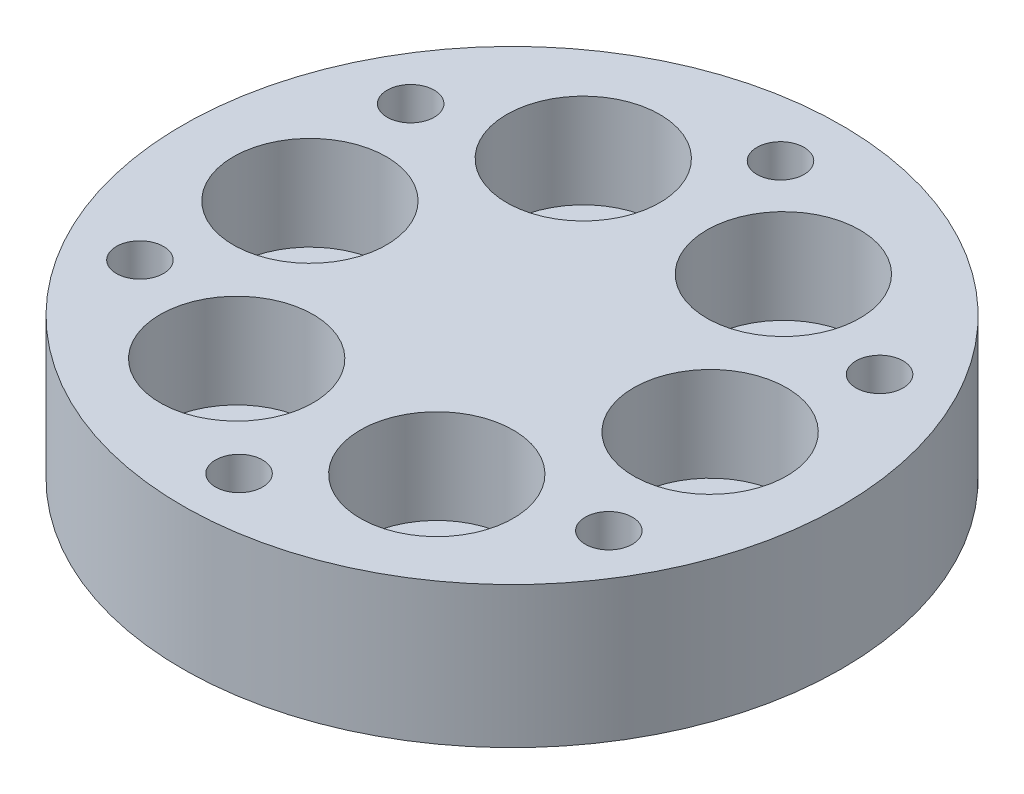
ISO-10303-21;
HEADER;
FILE_DESCRIPTION(('STEP AP214'),'2;1');
FILE_NAME('part.step','',(''),(''),'','','');
FILE_SCHEMA(('AUTOMOTIVE_DESIGN { 1 0 10303 214 1 1 1 1 }'));
ENDSEC;
DATA;
#1=APPLICATION_CONTEXT('core data for automotive mechanical design processes');
#2=APPLICATION_PROTOCOL_DEFINITION('international standard','automotive_design',2000,#1);
#3=PRODUCT_CONTEXT('',#1,'mechanical');
#4=PRODUCT('Part','Part','',(#3));
#5=PRODUCT_RELATED_PRODUCT_CATEGORY('part','',(#4));
#6=PRODUCT_DEFINITION_FORMATION('','',#4);
#7=PRODUCT_DEFINITION_CONTEXT('part definition',#1,'design');
#8=PRODUCT_DEFINITION('design','',#6,#7);
#9=PRODUCT_DEFINITION_SHAPE('','',#8);
#10=(LENGTH_UNIT() NAMED_UNIT(*) SI_UNIT(.MILLI.,.METRE.));
#11=(NAMED_UNIT(*) PLANE_ANGLE_UNIT() SI_UNIT($,.RADIAN.));
#12=(NAMED_UNIT(*) SI_UNIT($,.STERADIAN.) SOLID_ANGLE_UNIT());
#13=UNCERTAINTY_MEASURE_WITH_UNIT(LENGTH_MEASURE(1.E-05),#10,'distance_accuracy_value','');
#14=(GEOMETRIC_REPRESENTATION_CONTEXT(3) GLOBAL_UNCERTAINTY_ASSIGNED_CONTEXT((#13)) GLOBAL_UNIT_ASSIGNED_CONTEXT((#10,
#11,#12)) REPRESENTATION_CONTEXT('',''));
#15=CARTESIAN_POINT('',(0.,0.,0.));
#16=DIRECTION('',(0.,0.,1.));
#17=DIRECTION('',(1.,0.,0.));
#18=AXIS2_PLACEMENT_3D('',#15,#16,#17);
#19=CARTESIAN_POINT('',(0.0216779736944117,0.,-0.151745803292673));
#20=DIRECTION('',(0.,1.,0.));
#21=DIRECTION('',(1.,0.,0.));
#22=AXIS2_PLACEMENT_3D('',#19,#20,#21);
#23=PLANE('',#22);
#24=CARTESIAN_POINT('',(0.0493775983705208,0.,23.0711107078364));
#25=DIRECTION('',(0.,-1.,0.));
#26=DIRECTION('',(1.,0.,0.));
#27=AXIS2_PLACEMENT_3D('',#24,#25,#26);
#28=CIRCLE('',#27,2.);
#29=CARTESIAN_POINT('',(-1.95062240162948,0.,23.0711107078364));
#30=VERTEX_POINT('',#29);
#31=EDGE_CURVE('E321',#30,#30,#28,.T.);
#32=ORIENTED_EDGE('',*,*,#31,.F.);
#33=EDGE_LOOP('',(#32));
#34=FACE_BOUND('',#33,.T.);
#35=CARTESIAN_POINT('',(19.9679618854126,0.,11.5711107078364));
#36=DIRECTION('',(0.,-1.,0.));
#37=DIRECTION('',(1.,0.,0.));
#38=AXIS2_PLACEMENT_3D('',#35,#36,#37);
#39=CIRCLE('',#38,2.);
#40=CARTESIAN_POINT('',(17.9679618854126,0.,11.5711107078364));
#41=VERTEX_POINT('',#40);
#42=EDGE_CURVE('E352',#41,#41,#39,.T.);
#43=ORIENTED_EDGE('',*,*,#42,.F.);
#44=EDGE_LOOP('',(#43));
#45=FACE_BOUND('',#44,.T.);
#46=CARTESIAN_POINT('',(19.9679618854126,0.,-11.4288892921636));
#47=DIRECTION('',(0.,-1.,0.));
#48=DIRECTION('',(1.,0.,0.));
#49=AXIS2_PLACEMENT_3D('',#46,#47,#48);
#50=CIRCLE('',#49,2.);
#51=CARTESIAN_POINT('',(17.9679618854126,0.,-11.4288892921636));
#52=VERTEX_POINT('',#51);
#53=EDGE_CURVE('E244',#52,#52,#50,.T.);
#54=ORIENTED_EDGE('',*,*,#53,.F.);
#55=EDGE_LOOP('',(#54));
#56=FACE_BOUND('',#55,.T.);
#57=CARTESIAN_POINT('',(0.0493775983705294,0.,-22.9288892921636));
#58=DIRECTION('',(0.,-1.,0.));
#59=DIRECTION('',(1.,0.,0.));
#60=AXIS2_PLACEMENT_3D('',#57,#58,#59);
#61=CIRCLE('',#60,2.);
#62=CARTESIAN_POINT('',(-1.95062240162947,0.,-22.9288892921636));
#63=VERTEX_POINT('',#62);
#64=EDGE_CURVE('E249',#63,#63,#61,.T.);
#65=ORIENTED_EDGE('',*,*,#64,.F.);
#66=EDGE_LOOP('',(#65));
#67=FACE_BOUND('',#66,.T.);
#68=CARTESIAN_POINT('',(-19.8692066886716,0.,-11.4288892921636));
#69=DIRECTION('',(0.,-1.,0.));
#70=DIRECTION('',(1.,0.,0.));
#71=AXIS2_PLACEMENT_3D('',#68,#69,#70);
#72=CIRCLE('',#71,2.);
#73=CARTESIAN_POINT('',(-21.8692066886716,0.,-11.4288892921636));
#74=VERTEX_POINT('',#73);
#75=EDGE_CURVE('E290',#74,#74,#72,.T.);
#76=ORIENTED_EDGE('',*,*,#75,.F.);
#77=EDGE_LOOP('',(#76));
#78=FACE_BOUND('',#77,.T.);
#79=CARTESIAN_POINT('',(-19.8692066886716,0.,11.5711107078364));
#80=DIRECTION('',(0.,-1.,0.));
#81=DIRECTION('',(1.,0.,0.));
#82=AXIS2_PLACEMENT_3D('',#79,#80,#81);
#83=CIRCLE('',#82,2.);
#84=CARTESIAN_POINT('',(-21.8692066886716,0.,11.5711107078364));
#85=VERTEX_POINT('',#84);
#86=EDGE_CURVE('E257',#85,#85,#83,.T.);
#87=ORIENTED_EDGE('',*,*,#86,.F.);
#88=EDGE_LOOP('',(#87));
#89=FACE_BOUND('',#88,.T.);
#90=CARTESIAN_POINT('',(-8.5,0.,-14.7224318643355));
#91=DIRECTION('',(0.,-1.,0.));
#92=DIRECTION('',(1.,0.,0.));
#93=AXIS2_PLACEMENT_3D('',#90,#91,#92);
#94=CIRCLE('',#93,2.);
#95=CARTESIAN_POINT('',(-10.5,0.,-14.7224318643355));
#96=VERTEX_POINT('',#95);
#97=EDGE_CURVE('E296',#96,#96,#94,.T.);
#98=ORIENTED_EDGE('',*,*,#97,.F.);
#99=EDGE_LOOP('',(#98));
#100=FACE_BOUND('',#99,.T.);
#101=CARTESIAN_POINT('',(-8.5,0.,14.7224318643355));
#102=DIRECTION('',(0.,-1.,0.));
#103=DIRECTION('',(1.,0.,0.));
#104=AXIS2_PLACEMENT_3D('',#101,#102,#103);
#105=CIRCLE('',#104,2.);
#106=CARTESIAN_POINT('',(-10.5,0.,14.7224318643355));
#107=VERTEX_POINT('',#106);
#108=EDGE_CURVE('E311',#107,#107,#105,.T.);
#109=ORIENTED_EDGE('',*,*,#108,.F.);
#110=EDGE_LOOP('',(#109));
#111=FACE_BOUND('',#110,.T.);
#112=CARTESIAN_POINT('',(8.5,0.,14.7224318643355));
#113=DIRECTION('',(0.,-1.,0.));
#114=DIRECTION('',(1.,0.,0.));
#115=AXIS2_PLACEMENT_3D('',#112,#113,#114);
#116=CIRCLE('',#115,2.);
#117=CARTESIAN_POINT('',(6.5,0.,14.7224318643355));
#118=VERTEX_POINT('',#117);
#119=EDGE_CURVE('E279',#118,#118,#116,.T.);
#120=ORIENTED_EDGE('',*,*,#119,.F.);
#121=EDGE_LOOP('',(#120));
#122=FACE_BOUND('',#121,.T.);
#123=CARTESIAN_POINT('',(8.5,0.,-14.7224318643355));
#124=DIRECTION('',(0.,-1.,0.));
#125=DIRECTION('',(1.,0.,0.));
#126=AXIS2_PLACEMENT_3D('',#123,#124,#125);
#127=CIRCLE('',#126,2.);
#128=CARTESIAN_POINT('',(6.5,0.,-14.7224318643355));
#129=VERTEX_POINT('',#128);
#130=EDGE_CURVE('E351',#129,#129,#127,.T.);
#131=ORIENTED_EDGE('',*,*,#130,.F.);
#132=EDGE_LOOP('',(#131));
#133=FACE_BOUND('',#132,.T.);
#134=CARTESIAN_POINT('',(-17.,0.,0.));
#135=DIRECTION('',(0.,-1.,0.));
#136=DIRECTION('',(1.,0.,0.));
#137=AXIS2_PLACEMENT_3D('',#134,#135,#136);
#138=CIRCLE('',#137,2.);
#139=CARTESIAN_POINT('',(-19.,0.,0.));
#140=VERTEX_POINT('',#139);
#141=EDGE_CURVE('E218',#140,#140,#138,.T.);
#142=ORIENTED_EDGE('',*,*,#141,.F.);
#143=EDGE_LOOP('',(#142));
#144=FACE_BOUND('',#143,.T.);
#145=CARTESIAN_POINT('',(17.,0.,0.));
#146=DIRECTION('',(0.,-1.,0.));
#147=DIRECTION('',(1.,0.,0.));
#148=AXIS2_PLACEMENT_3D('',#145,#146,#147);
#149=CIRCLE('',#148,2.);
#150=CARTESIAN_POINT('',(15.,0.,0.));
#151=VERTEX_POINT('',#150);
#152=EDGE_CURVE('E235',#151,#151,#149,.T.);
#153=ORIENTED_EDGE('',*,*,#152,.F.);
#154=EDGE_LOOP('',(#153));
#155=FACE_BOUND('',#154,.T.);
#156=CARTESIAN_POINT('',(0.0216779736944123,0.,-0.151745803292674));
#157=DIRECTION('',(0.,1.,0.));
#158=DIRECTION('',(-1.,0.,0.));
#159=AXIS2_PLACEMENT_3D('',#156,#157,#158);
#160=CIRCLE('',#159,28.);
#161=CARTESIAN_POINT('',(28.0216779736944,0.,-0.151745803292677));
#162=VERTEX_POINT('',#161);
#163=EDGE_CURVE('E11',#162,#162,#160,.T.);
#164=ORIENTED_EDGE('',*,*,#163,.F.);
#165=EDGE_LOOP('',(#164));
#166=FACE_BOUND('',#165,.T.);
#167=ADVANCED_FACE('F17',(#34,#45,#56,#67,#78,#89,#100,#111,#122,#133,#144,#155,#166),#23,.F.);
#168=CARTESIAN_POINT('',(0.0216779736944117,12.,-0.151745803292673));
#169=DIRECTION('',(0.,1.,0.));
#170=DIRECTION('',(1.,0.,0.));
#171=AXIS2_PLACEMENT_3D('',#168,#169,#170);
#172=PLANE('',#171);
#173=CARTESIAN_POINT('',(0.0493775983705208,12.,23.0711107078364));
#174=DIRECTION('',(0.,-1.,0.));
#175=DIRECTION('',(1.,0.,0.));
#176=AXIS2_PLACEMENT_3D('',#173,#174,#175);
#177=CIRCLE('',#176,2.);
#178=CARTESIAN_POINT('',(-1.95062240162948,12.,23.0711107078364));
#179=VERTEX_POINT('',#178);
#180=EDGE_CURVE('E213',#179,#179,#177,.T.);
#181=ORIENTED_EDGE('',*,*,#180,.T.);
#182=EDGE_LOOP('',(#181));
#183=FACE_BOUND('',#182,.T.);
#184=CARTESIAN_POINT('',(19.9679618854126,12.,11.5711107078364));
#185=DIRECTION('',(0.,-1.,0.));
#186=DIRECTION('',(1.,0.,0.));
#187=AXIS2_PLACEMENT_3D('',#184,#185,#186);
#188=CIRCLE('',#187,2.);
#189=CARTESIAN_POINT('',(17.9679618854126,12.,11.5711107078364));
#190=VERTEX_POINT('',#189);
#191=EDGE_CURVE('E343',#190,#190,#188,.T.);
#192=ORIENTED_EDGE('',*,*,#191,.T.);
#193=EDGE_LOOP('',(#192));
#194=FACE_BOUND('',#193,.T.);
#195=CARTESIAN_POINT('',(19.9679618854126,12.,-11.4288892921636));
#196=DIRECTION('',(0.,-1.,0.));
#197=DIRECTION('',(1.,0.,0.));
#198=AXIS2_PLACEMENT_3D('',#195,#196,#197);
#199=CIRCLE('',#198,2.);
#200=CARTESIAN_POINT('',(17.9679618854126,12.,-11.4288892921636));
#201=VERTEX_POINT('',#200);
#202=EDGE_CURVE('E355',#201,#201,#199,.T.);
#203=ORIENTED_EDGE('',*,*,#202,.T.);
#204=EDGE_LOOP('',(#203));
#205=FACE_BOUND('',#204,.T.);
#206=CARTESIAN_POINT('',(0.0493775983705294,12.,-22.9288892921636));
#207=DIRECTION('',(0.,-1.,0.));
#208=DIRECTION('',(1.,0.,0.));
#209=AXIS2_PLACEMENT_3D('',#206,#207,#208);
#210=CIRCLE('',#209,2.);
#211=CARTESIAN_POINT('',(-1.95062240162947,12.,-22.9288892921636));
#212=VERTEX_POINT('',#211);
#213=EDGE_CURVE('E240',#212,#212,#210,.T.);
#214=ORIENTED_EDGE('',*,*,#213,.T.);
#215=EDGE_LOOP('',(#214));
#216=FACE_BOUND('',#215,.T.);
#217=CARTESIAN_POINT('',(-19.8692066886716,12.,-11.4288892921636));
#218=DIRECTION('',(0.,-1.,0.));
#219=DIRECTION('',(1.,0.,0.));
#220=AXIS2_PLACEMENT_3D('',#217,#218,#219);
#221=CIRCLE('',#220,2.);
#222=CARTESIAN_POINT('',(-21.8692066886716,12.,-11.4288892921636));
#223=VERTEX_POINT('',#222);
#224=EDGE_CURVE('E252',#223,#223,#221,.T.);
#225=ORIENTED_EDGE('',*,*,#224,.T.);
#226=EDGE_LOOP('',(#225));
#227=FACE_BOUND('',#226,.T.);
#228=CARTESIAN_POINT('',(-19.8692066886716,12.,11.5711107078364));
#229=DIRECTION('',(0.,-1.,0.));
#230=DIRECTION('',(1.,0.,0.));
#231=AXIS2_PLACEMENT_3D('',#228,#229,#230);
#232=CIRCLE('',#231,2.);
#233=CARTESIAN_POINT('',(-21.8692066886716,12.,11.5711107078364));
#234=VERTEX_POINT('',#233);
#235=EDGE_CURVE('E258',#234,#234,#232,.T.);
#236=ORIENTED_EDGE('',*,*,#235,.T.);
#237=EDGE_LOOP('',(#236));
#238=FACE_BOUND('',#237,.T.);
#239=CARTESIAN_POINT('',(-17.,12.,0.));
#240=DIRECTION('',(0.,-1.,0.));
#241=DIRECTION('',(1.,0.,0.));
#242=AXIS2_PLACEMENT_3D('',#239,#240,#241);
#243=CIRCLE('',#242,6.5);
#244=CARTESIAN_POINT('',(-23.5,12.,0.));
#245=VERTEX_POINT('',#244);
#246=EDGE_CURVE('E211',#245,#245,#243,.T.);
#247=ORIENTED_EDGE('',*,*,#246,.T.);
#248=EDGE_LOOP('',(#247));
#249=FACE_BOUND('',#248,.T.);
#250=CARTESIAN_POINT('',(17.,12.,0.));
#251=DIRECTION('',(0.,-1.,0.));
#252=DIRECTION('',(1.,0.,0.));
#253=AXIS2_PLACEMENT_3D('',#250,#251,#252);
#254=CIRCLE('',#253,6.5);
#255=CARTESIAN_POINT('',(10.5,12.,0.));
#256=VERTEX_POINT('',#255);
#257=EDGE_CURVE('E263',#256,#256,#254,.T.);
#258=ORIENTED_EDGE('',*,*,#257,.T.);
#259=EDGE_LOOP('',(#258));
#260=FACE_BOUND('',#259,.T.);
#261=CARTESIAN_POINT('',(-8.5,12.,14.7224318643355));
#262=DIRECTION('',(0.,-1.,0.));
#263=DIRECTION('',(1.,0.,0.));
#264=AXIS2_PLACEMENT_3D('',#261,#262,#263);
#265=CIRCLE('',#264,6.5);
#266=CARTESIAN_POINT('',(-15.,12.,14.7224318643355));
#267=VERTEX_POINT('',#266);
#268=EDGE_CURVE('E202',#267,#267,#265,.T.);
#269=ORIENTED_EDGE('',*,*,#268,.T.);
#270=EDGE_LOOP('',(#269));
#271=FACE_BOUND('',#270,.T.);
#272=CARTESIAN_POINT('',(-8.5,12.,-14.7224318643355));
#273=DIRECTION('',(0.,-1.,0.));
#274=DIRECTION('',(1.,0.,0.));
#275=AXIS2_PLACEMENT_3D('',#272,#273,#274);
#276=CIRCLE('',#275,6.5);
#277=CARTESIAN_POINT('',(-15.,12.,-14.7224318643355));
#278=VERTEX_POINT('',#277);
#279=EDGE_CURVE('E203',#278,#278,#276,.T.);
#280=ORIENTED_EDGE('',*,*,#279,.T.);
#281=EDGE_LOOP('',(#280));
#282=FACE_BOUND('',#281,.T.);
#283=CARTESIAN_POINT('',(8.5,12.,-14.7224318643355));
#284=DIRECTION('',(0.,-1.,0.));
#285=DIRECTION('',(1.,0.,0.));
#286=AXIS2_PLACEMENT_3D('',#283,#284,#285);
#287=CIRCLE('',#286,6.5);
#288=CARTESIAN_POINT('',(2.,12.,-14.7224318643355));
#289=VERTEX_POINT('',#288);
#290=EDGE_CURVE('E190',#289,#289,#287,.T.);
#291=ORIENTED_EDGE('',*,*,#290,.T.);
#292=EDGE_LOOP('',(#291));
#293=FACE_BOUND('',#292,.T.);
#294=CARTESIAN_POINT('',(8.5,12.,14.7224318643354));
#295=DIRECTION('',(0.,-1.,0.));
#296=DIRECTION('',(1.,0.,0.));
#297=AXIS2_PLACEMENT_3D('',#294,#295,#296);
#298=CIRCLE('',#297,6.5);
#299=CARTESIAN_POINT('',(2.,12.,14.7224318643354));
#300=VERTEX_POINT('',#299);
#301=EDGE_CURVE('E174',#300,#300,#298,.T.);
#302=ORIENTED_EDGE('',*,*,#301,.T.);
#303=EDGE_LOOP('',(#302));
#304=FACE_BOUND('',#303,.T.);
#305=CARTESIAN_POINT('',(0.0216779736944123,12.,-0.151745803292674));
#306=DIRECTION('',(0.,1.,0.));
#307=DIRECTION('',(-1.,0.,0.));
#308=AXIS2_PLACEMENT_3D('',#305,#306,#307);
#309=CIRCLE('',#308,28.);
#310=CARTESIAN_POINT('',(28.0216779736944,12.,-0.151745803292677));
#311=VERTEX_POINT('',#310);
#312=EDGE_CURVE('E328',#311,#311,#309,.T.);
#313=ORIENTED_EDGE('',*,*,#312,.T.);
#314=EDGE_LOOP('',(#313));
#315=FACE_BOUND('',#314,.T.);
#316=ADVANCED_FACE('F175',(#183,#194,#205,#216,#227,#238,#249,#260,#271,#282,#293,#304,#315),
#172,.T.);
#317=CARTESIAN_POINT('',(0.0216779736944123,0.,-0.151745803292674));
#318=DIRECTION('',(0.,1.,0.));
#319=DIRECTION('',(-1.,0.,0.));
#320=AXIS2_PLACEMENT_3D('',#317,#318,#319);
#321=CYLINDRICAL_SURFACE('',#320,28.);
#322=ORIENTED_EDGE('',*,*,#312,.F.);
#323=DIRECTION('',(0.,-1.,0.));
#324=VECTOR('',#323,1.);
#325=CARTESIAN_POINT('',(28.0216779736944,0.,-0.151745803292677));
#326=LINE('',#325,#324);
#327=EDGE_CURVE('E28',#311,#162,#326,.T.);
#328=ORIENTED_EDGE('',*,*,#327,.T.);
#329=ORIENTED_EDGE('',*,*,#163,.T.);
#330=ORIENTED_EDGE('',*,*,#327,.F.);
#331=EDGE_LOOP('',(#322,#328,#329,#330));
#332=FACE_BOUND('',#331,.T.);
#333=ADVANCED_FACE('F415',(#332),#321,.T.);
#334=CARTESIAN_POINT('',(-19.8692066886716,0.,11.5711107078364));
#335=DIRECTION('',(0.,1.,0.));
#336=DIRECTION('',(1.,0.,0.));
#337=AXIS2_PLACEMENT_3D('',#334,#335,#336);
#338=CYLINDRICAL_SURFACE('',#337,2.);
#339=ORIENTED_EDGE('',*,*,#235,.F.);
#340=DIRECTION('',(0.,-1.,0.));
#341=VECTOR('',#340,1.);
#342=CARTESIAN_POINT('',(-21.8692066886716,0.,11.5711107078364));
#343=LINE('',#342,#341);
#344=EDGE_CURVE('E253',#234,#85,#343,.T.);
#345=ORIENTED_EDGE('',*,*,#344,.T.);
#346=ORIENTED_EDGE('',*,*,#86,.T.);
#347=ORIENTED_EDGE('',*,*,#344,.F.);
#348=EDGE_LOOP('',(#339,#345,#346,#347));
#349=FACE_BOUND('',#348,.T.);
#350=ADVANCED_FACE('F454',(#349),#338,.F.);
#351=CARTESIAN_POINT('',(-19.8692066886716,0.,-11.4288892921636));
#352=DIRECTION('',(0.,1.,0.));
#353=DIRECTION('',(1.,0.,0.));
#354=AXIS2_PLACEMENT_3D('',#351,#352,#353);
#355=CYLINDRICAL_SURFACE('',#354,2.);
#356=ORIENTED_EDGE('',*,*,#224,.F.);
#357=DIRECTION('',(0.,-1.,0.));
#358=VECTOR('',#357,1.);
#359=CARTESIAN_POINT('',(-21.8692066886716,0.,-11.4288892921636));
#360=LINE('',#359,#358);
#361=EDGE_CURVE('E292',#223,#74,#360,.T.);
#362=ORIENTED_EDGE('',*,*,#361,.T.);
#363=ORIENTED_EDGE('',*,*,#75,.T.);
#364=ORIENTED_EDGE('',*,*,#361,.F.);
#365=EDGE_LOOP('',(#356,#362,#363,#364));
#366=FACE_BOUND('',#365,.T.);
#367=ADVANCED_FACE('F390',(#366),#355,.F.);
#368=CARTESIAN_POINT('',(0.0493775983705294,0.,-22.9288892921636));
#369=DIRECTION('',(0.,1.,0.));
#370=DIRECTION('',(1.,0.,0.));
#371=AXIS2_PLACEMENT_3D('',#368,#369,#370);
#372=CYLINDRICAL_SURFACE('',#371,2.);
#373=ORIENTED_EDGE('',*,*,#213,.F.);
#374=DIRECTION('',(0.,-1.,0.));
#375=VECTOR('',#374,1.);
#376=CARTESIAN_POINT('',(-1.95062240162947,0.,-22.9288892921636));
#377=LINE('',#376,#375);
#378=EDGE_CURVE('E243',#212,#63,#377,.T.);
#379=ORIENTED_EDGE('',*,*,#378,.T.);
#380=ORIENTED_EDGE('',*,*,#64,.T.);
#381=ORIENTED_EDGE('',*,*,#378,.F.);
#382=EDGE_LOOP('',(#373,#379,#380,#381));
#383=FACE_BOUND('',#382,.T.);
#384=ADVANCED_FACE('F484',(#383),#372,.F.);
#385=CARTESIAN_POINT('',(19.9679618854126,0.,-11.4288892921636));
#386=DIRECTION('',(0.,1.,0.));
#387=DIRECTION('',(1.,0.,0.));
#388=AXIS2_PLACEMENT_3D('',#385,#386,#387);
#389=CYLINDRICAL_SURFACE('',#388,2.);
#390=ORIENTED_EDGE('',*,*,#202,.F.);
#391=DIRECTION('',(0.,-1.,0.));
#392=VECTOR('',#391,1.);
#393=CARTESIAN_POINT('',(17.9679618854126,0.,-11.4288892921636));
#394=LINE('',#393,#392);
#395=EDGE_CURVE('E341',#201,#52,#394,.T.);
#396=ORIENTED_EDGE('',*,*,#395,.T.);
#397=ORIENTED_EDGE('',*,*,#53,.T.);
#398=ORIENTED_EDGE('',*,*,#395,.F.);
#399=EDGE_LOOP('',(#390,#396,#397,#398));
#400=FACE_BOUND('',#399,.T.);
#401=ADVANCED_FACE('F480',(#400),#389,.F.);
#402=CARTESIAN_POINT('',(19.9679618854126,0.,11.5711107078364));
#403=DIRECTION('',(0.,1.,0.));
#404=DIRECTION('',(1.,0.,0.));
#405=AXIS2_PLACEMENT_3D('',#402,#403,#404);
#406=CYLINDRICAL_SURFACE('',#405,2.);
#407=ORIENTED_EDGE('',*,*,#191,.F.);
#408=DIRECTION('',(0.,-1.,0.));
#409=VECTOR('',#408,1.);
#410=CARTESIAN_POINT('',(17.9679618854126,0.,11.5711107078364));
#411=LINE('',#410,#409);
#412=EDGE_CURVE('E347',#190,#41,#411,.T.);
#413=ORIENTED_EDGE('',*,*,#412,.T.);
#414=ORIENTED_EDGE('',*,*,#42,.T.);
#415=ORIENTED_EDGE('',*,*,#412,.F.);
#416=EDGE_LOOP('',(#407,#413,#414,#415));
#417=FACE_BOUND('',#416,.T.);
#418=ADVANCED_FACE('F483',(#417),#406,.F.);
#419=CARTESIAN_POINT('',(0.0493775983705208,0.,23.0711107078364));
#420=DIRECTION('',(0.,1.,0.));
#421=DIRECTION('',(1.,0.,0.));
#422=AXIS2_PLACEMENT_3D('',#419,#420,#421);
#423=CYLINDRICAL_SURFACE('',#422,2.);
#424=ORIENTED_EDGE('',*,*,#180,.F.);
#425=DIRECTION('',(0.,-1.,0.));
#426=VECTOR('',#425,1.);
#427=CARTESIAN_POINT('',(-1.95062240162948,0.,23.0711107078364));
#428=LINE('',#427,#426);
#429=EDGE_CURVE('E356',#179,#30,#428,.T.);
#430=ORIENTED_EDGE('',*,*,#429,.T.);
#431=ORIENTED_EDGE('',*,*,#31,.T.);
#432=ORIENTED_EDGE('',*,*,#429,.F.);
#433=EDGE_LOOP('',(#424,#430,#431,#432));
#434=FACE_BOUND('',#433,.T.);
#435=ADVANCED_FACE('F518',(#434),#423,.F.);
#436=CARTESIAN_POINT('',(-17.,-8.,0.));
#437=DIRECTION('',(0.,1.,0.));
#438=DIRECTION('',(1.,0.,0.));
#439=AXIS2_PLACEMENT_3D('',#436,#437,#438);
#440=CYLINDRICAL_SURFACE('',#439,6.5);
#441=CARTESIAN_POINT('',(-17.,4.,0.));
#442=DIRECTION('',(0.,-1.,0.));
#443=DIRECTION('',(1.,0.,0.));
#444=AXIS2_PLACEMENT_3D('',#441,#442,#443);
#445=CIRCLE('',#444,6.5);
#446=CARTESIAN_POINT('',(-23.5,4.,0.));
#447=VERTEX_POINT('',#446);
#448=EDGE_CURVE('E226',#447,#447,#445,.T.);
#449=ORIENTED_EDGE('',*,*,#448,.T.);
#450=DIRECTION('',(0.,1.,0.));
#451=VECTOR('',#450,1.);
#452=CARTESIAN_POINT('',(-23.5,-8.,0.));
#453=LINE('',#452,#451);
#454=EDGE_CURVE('E214',#447,#245,#453,.T.);
#455=ORIENTED_EDGE('',*,*,#454,.T.);
#456=ORIENTED_EDGE('',*,*,#246,.F.);
#457=ORIENTED_EDGE('',*,*,#454,.F.);
#458=EDGE_LOOP('',(#449,#455,#456,#457));
#459=FACE_BOUND('',#458,.T.);
#460=ADVANCED_FACE('F504',(#459),#440,.F.);
#461=CARTESIAN_POINT('',(17.,-8.,0.));
#462=DIRECTION('',(0.,1.,0.));
#463=DIRECTION('',(1.,0.,0.));
#464=AXIS2_PLACEMENT_3D('',#461,#462,#463);
#465=CYLINDRICAL_SURFACE('',#464,6.5);
#466=CARTESIAN_POINT('',(17.,4.,0.));
#467=DIRECTION('',(0.,-1.,0.));
#468=DIRECTION('',(1.,0.,0.));
#469=AXIS2_PLACEMENT_3D('',#466,#467,#468);
#470=CIRCLE('',#469,6.5);
#471=CARTESIAN_POINT('',(10.5,4.,0.));
#472=VERTEX_POINT('',#471);
#473=EDGE_CURVE('E21',#472,#472,#470,.T.);
#474=ORIENTED_EDGE('',*,*,#473,.T.);
#475=DIRECTION('',(0.,1.,0.));
#476=VECTOR('',#475,1.);
#477=CARTESIAN_POINT('',(10.5,-8.,0.));
#478=LINE('',#477,#476);
#479=EDGE_CURVE('E260',#472,#256,#478,.T.);
#480=ORIENTED_EDGE('',*,*,#479,.T.);
#481=ORIENTED_EDGE('',*,*,#257,.F.);
#482=ORIENTED_EDGE('',*,*,#479,.F.);
#483=EDGE_LOOP('',(#474,#480,#481,#482));
#484=FACE_BOUND('',#483,.T.);
#485=ADVANCED_FACE('F488',(#484),#465,.F.);
#486=CARTESIAN_POINT('',(-8.5,-8.,14.7224318643355));
#487=DIRECTION('',(0.,1.,0.));
#488=DIRECTION('',(1.,0.,0.));
#489=AXIS2_PLACEMENT_3D('',#486,#487,#488);
#490=CYLINDRICAL_SURFACE('',#489,6.5);
#491=CARTESIAN_POINT('',(-8.5,4.,14.7224318643355));
#492=DIRECTION('',(0.,-1.,0.));
#493=DIRECTION('',(1.,0.,0.));
#494=AXIS2_PLACEMENT_3D('',#491,#492,#493);
#495=CIRCLE('',#494,6.5);
#496=CARTESIAN_POINT('',(-15.,4.,14.7224318643355));
#497=VERTEX_POINT('',#496);
#498=EDGE_CURVE('E305',#497,#497,#495,.T.);
#499=ORIENTED_EDGE('',*,*,#498,.T.);
#500=DIRECTION('',(0.,1.,0.));
#501=VECTOR('',#500,1.);
#502=CARTESIAN_POINT('',(-15.,-8.,14.7224318643355));
#503=LINE('',#502,#501);
#504=EDGE_CURVE('E198',#497,#267,#503,.T.);
#505=ORIENTED_EDGE('',*,*,#504,.T.);
#506=ORIENTED_EDGE('',*,*,#268,.F.);
#507=ORIENTED_EDGE('',*,*,#504,.F.);
#508=EDGE_LOOP('',(#499,#505,#506,#507));
#509=FACE_BOUND('',#508,.T.);
#510=ADVANCED_FACE('F469',(#509),#490,.F.);
#511=CARTESIAN_POINT('',(-8.5,-8.,-14.7224318643355));
#512=DIRECTION('',(0.,1.,0.));
#513=DIRECTION('',(1.,0.,0.));
#514=AXIS2_PLACEMENT_3D('',#511,#512,#513);
#515=CYLINDRICAL_SURFACE('',#514,6.5);
#516=CARTESIAN_POINT('',(-8.5,4.,-14.7224318643355));
#517=DIRECTION('',(0.,-1.,0.));
#518=DIRECTION('',(1.,0.,0.));
#519=AXIS2_PLACEMENT_3D('',#516,#517,#518);
#520=CIRCLE('',#519,6.5);
#521=CARTESIAN_POINT('',(-15.,4.,-14.7224318643355));
#522=VERTEX_POINT('',#521);
#523=EDGE_CURVE('E192',#522,#522,#520,.T.);
#524=ORIENTED_EDGE('',*,*,#523,.T.);
#525=DIRECTION('',(0.,1.,0.));
#526=VECTOR('',#525,1.);
#527=CARTESIAN_POINT('',(-15.,-8.,-14.7224318643355));
#528=LINE('',#527,#526);
#529=EDGE_CURVE('E168',#522,#278,#528,.T.);
#530=ORIENTED_EDGE('',*,*,#529,.T.);
#531=ORIENTED_EDGE('',*,*,#279,.F.);
#532=ORIENTED_EDGE('',*,*,#529,.F.);
#533=EDGE_LOOP('',(#524,#530,#531,#532));
#534=FACE_BOUND('',#533,.T.);
#535=ADVANCED_FACE('F466',(#534),#515,.F.);
#536=CARTESIAN_POINT('',(8.5,-8.,-14.7224318643355));
#537=DIRECTION('',(0.,1.,0.));
#538=DIRECTION('',(1.,0.,0.));
#539=AXIS2_PLACEMENT_3D('',#536,#537,#538);
#540=CYLINDRICAL_SURFACE('',#539,6.5);
#541=CARTESIAN_POINT('',(8.5,4.,-14.7224318643355));
#542=DIRECTION('',(0.,-1.,0.));
#543=DIRECTION('',(1.,0.,0.));
#544=AXIS2_PLACEMENT_3D('',#541,#542,#543);
#545=CIRCLE('',#544,6.5);
#546=CARTESIAN_POINT('',(2.,4.,-14.7224318643355));
#547=VERTEX_POINT('',#546);
#548=EDGE_CURVE('E327',#547,#547,#545,.T.);
#549=ORIENTED_EDGE('',*,*,#548,.T.);
#550=DIRECTION('',(0.,1.,0.));
#551=VECTOR('',#550,1.);
#552=CARTESIAN_POINT('',(2.,-8.,-14.7224318643355));
#553=LINE('',#552,#551);
#554=EDGE_CURVE('E181',#547,#289,#553,.T.);
#555=ORIENTED_EDGE('',*,*,#554,.T.);
#556=ORIENTED_EDGE('',*,*,#290,.F.);
#557=ORIENTED_EDGE('',*,*,#554,.F.);
#558=EDGE_LOOP('',(#549,#555,#556,#557));
#559=FACE_BOUND('',#558,.T.);
#560=ADVANCED_FACE('F443',(#559),#540,.F.);
#561=CARTESIAN_POINT('',(8.5,-8.,14.7224318643354));
#562=DIRECTION('',(0.,1.,0.));
#563=DIRECTION('',(1.,0.,0.));
#564=AXIS2_PLACEMENT_3D('',#561,#562,#563);
#565=CYLINDRICAL_SURFACE('',#564,6.5);
#566=CARTESIAN_POINT('',(8.5,4.,14.7224318643354));
#567=DIRECTION('',(0.,-1.,0.));
#568=DIRECTION('',(1.,0.,0.));
#569=AXIS2_PLACEMENT_3D('',#566,#567,#568);
#570=CIRCLE('',#569,6.5);
#571=CARTESIAN_POINT('',(2.,4.,14.7224318643355));
#572=VERTEX_POINT('',#571);
#573=EDGE_CURVE('E282',#572,#572,#570,.T.);
#574=ORIENTED_EDGE('',*,*,#573,.T.);
#575=DIRECTION('',(0.,1.,0.));
#576=VECTOR('',#575,1.);
#577=CARTESIAN_POINT('',(2.,-8.,14.7224318643354));
#578=LINE('',#577,#576);
#579=EDGE_CURVE('E182',#572,#300,#578,.T.);
#580=ORIENTED_EDGE('',*,*,#579,.T.);
#581=ORIENTED_EDGE('',*,*,#301,.F.);
#582=ORIENTED_EDGE('',*,*,#579,.F.);
#583=EDGE_LOOP('',(#574,#580,#581,#582));
#584=FACE_BOUND('',#583,.T.);
#585=ADVANCED_FACE('F463',(#584),#565,.F.);
#586=CARTESIAN_POINT('',(-8.5,4.,-14.7224318643355));
#587=DIRECTION('',(0.,1.,0.));
#588=DIRECTION('',(1.,0.,0.));
#589=AXIS2_PLACEMENT_3D('',#586,#587,#588);
#590=PLANE('',#589);
#591=CARTESIAN_POINT('',(-8.5,4.,-14.7224318643355));
#592=DIRECTION('',(0.,-1.,0.));
#593=DIRECTION('',(1.,0.,0.));
#594=AXIS2_PLACEMENT_3D('',#591,#592,#593);
#595=CIRCLE('',#594,2.);
#596=CARTESIAN_POINT('',(-10.5,4.,-14.7224318643355));
#597=VERTEX_POINT('',#596);
#598=EDGE_CURVE('E238',#597,#597,#595,.T.);
#599=ORIENTED_EDGE('',*,*,#598,.T.);
#600=EDGE_LOOP('',(#599));
#601=FACE_BOUND('',#600,.T.);
#602=ORIENTED_EDGE('',*,*,#523,.F.);
#603=EDGE_LOOP('',(#602));
#604=FACE_BOUND('',#603,.T.);
#605=ADVANCED_FACE('F459',(#601,#604),#590,.T.);
#606=CARTESIAN_POINT('',(-8.5,0.,-14.7224318643355));
#607=DIRECTION('',(0.,1.,0.));
#608=DIRECTION('',(1.,0.,0.));
#609=AXIS2_PLACEMENT_3D('',#606,#607,#608);
#610=CYLINDRICAL_SURFACE('',#609,2.);
#611=ORIENTED_EDGE('',*,*,#598,.F.);
#612=DIRECTION('',(0.,-1.,0.));
#613=VECTOR('',#612,1.);
#614=CARTESIAN_POINT('',(-10.5,0.,-14.7224318643355));
#615=LINE('',#614,#613);
#616=EDGE_CURVE('E293',#597,#96,#615,.T.);
#617=ORIENTED_EDGE('',*,*,#616,.T.);
#618=ORIENTED_EDGE('',*,*,#97,.T.);
#619=ORIENTED_EDGE('',*,*,#616,.F.);
#620=EDGE_LOOP('',(#611,#617,#618,#619));
#621=FACE_BOUND('',#620,.T.);
#622=ADVANCED_FACE('F462',(#621),#610,.F.);
#623=CARTESIAN_POINT('',(-8.5,4.,14.7224318643355));
#624=DIRECTION('',(0.,1.,0.));
#625=DIRECTION('',(1.,0.,0.));
#626=AXIS2_PLACEMENT_3D('',#623,#624,#625);
#627=PLANE('',#626);
#628=CARTESIAN_POINT('',(-8.5,4.,14.7224318643355));
#629=DIRECTION('',(0.,-1.,0.));
#630=DIRECTION('',(1.,0.,0.));
#631=AXIS2_PLACEMENT_3D('',#628,#629,#630);
#632=CIRCLE('',#631,2.);
#633=CARTESIAN_POINT('',(-10.5,4.,14.7224318643355));
#634=VERTEX_POINT('',#633);
#635=EDGE_CURVE('E334',#634,#634,#632,.T.);
#636=ORIENTED_EDGE('',*,*,#635,.T.);
#637=EDGE_LOOP('',(#636));
#638=FACE_BOUND('',#637,.T.);
#639=ORIENTED_EDGE('',*,*,#498,.F.);
#640=EDGE_LOOP('',(#639));
#641=FACE_BOUND('',#640,.T.);
#642=ADVANCED_FACE('F478',(#638,#641),#627,.T.);
#643=CARTESIAN_POINT('',(-8.5,0.,14.7224318643355));
#644=DIRECTION('',(0.,1.,0.));
#645=DIRECTION('',(1.,0.,0.));
#646=AXIS2_PLACEMENT_3D('',#643,#644,#645);
#647=CYLINDRICAL_SURFACE('',#646,2.);
#648=ORIENTED_EDGE('',*,*,#635,.F.);
#649=DIRECTION('',(0.,-1.,0.));
#650=VECTOR('',#649,1.);
#651=CARTESIAN_POINT('',(-10.5,0.,14.7224318643355));
#652=LINE('',#651,#650);
#653=EDGE_CURVE('E196',#634,#107,#652,.T.);
#654=ORIENTED_EDGE('',*,*,#653,.T.);
#655=ORIENTED_EDGE('',*,*,#108,.T.);
#656=ORIENTED_EDGE('',*,*,#653,.F.);
#657=EDGE_LOOP('',(#648,#654,#655,#656));
#658=FACE_BOUND('',#657,.T.);
#659=ADVANCED_FACE('F474',(#658),#647,.F.);
#660=CARTESIAN_POINT('',(8.5,4.,14.7224318643355));
#661=DIRECTION('',(0.,1.,0.));
#662=DIRECTION('',(1.,0.,0.));
#663=AXIS2_PLACEMENT_3D('',#660,#661,#662);
#664=PLANE('',#663);
#665=CARTESIAN_POINT('',(8.5,4.,14.7224318643355));
#666=DIRECTION('',(0.,-1.,0.));
#667=DIRECTION('',(1.,0.,0.));
#668=AXIS2_PLACEMENT_3D('',#665,#666,#667);
#669=CIRCLE('',#668,2.);
#670=CARTESIAN_POINT('',(6.5,4.,14.7224318643355));
#671=VERTEX_POINT('',#670);
#672=EDGE_CURVE('E323',#671,#671,#669,.T.);
#673=ORIENTED_EDGE('',*,*,#672,.T.);
#674=EDGE_LOOP('',(#673));
#675=FACE_BOUND('',#674,.T.);
#676=ORIENTED_EDGE('',*,*,#573,.F.);
#677=EDGE_LOOP('',(#676));
#678=FACE_BOUND('',#677,.T.);
#679=ADVANCED_FACE('F477',(#675,#678),#664,.T.);
#680=CARTESIAN_POINT('',(8.5,0.,14.7224318643355));
#681=DIRECTION('',(0.,1.,0.));
#682=DIRECTION('',(1.,0.,0.));
#683=AXIS2_PLACEMENT_3D('',#680,#681,#682);
#684=CYLINDRICAL_SURFACE('',#683,2.);
#685=ORIENTED_EDGE('',*,*,#672,.F.);
#686=DIRECTION('',(0.,-1.,0.));
#687=VECTOR('',#686,1.);
#688=CARTESIAN_POINT('',(6.5,0.,14.7224318643355));
#689=LINE('',#688,#687);
#690=EDGE_CURVE('E283',#671,#118,#689,.T.);
#691=ORIENTED_EDGE('',*,*,#690,.T.);
#692=ORIENTED_EDGE('',*,*,#119,.T.);
#693=ORIENTED_EDGE('',*,*,#690,.F.);
#694=EDGE_LOOP('',(#685,#691,#692,#693));
#695=FACE_BOUND('',#694,.T.);
#696=ADVANCED_FACE('F436',(#695),#684,.F.);
#697=CARTESIAN_POINT('',(8.5,4.,-14.7224318643355));
#698=DIRECTION('',(0.,1.,0.));
#699=DIRECTION('',(1.,0.,0.));
#700=AXIS2_PLACEMENT_3D('',#697,#698,#699);
#701=PLANE('',#700);
#702=CARTESIAN_POINT('',(8.5,4.,-14.7224318643355));
#703=DIRECTION('',(0.,-1.,0.));
#704=DIRECTION('',(1.,0.,0.));
#705=AXIS2_PLACEMENT_3D('',#702,#703,#704);
#706=CIRCLE('',#705,2.);
#707=CARTESIAN_POINT('',(6.5,4.,-14.7224318643355));
#708=VERTEX_POINT('',#707);
#709=EDGE_CURVE('E360',#708,#708,#706,.T.);
#710=ORIENTED_EDGE('',*,*,#709,.T.);
#711=EDGE_LOOP('',(#710));
#712=FACE_BOUND('',#711,.T.);
#713=ORIENTED_EDGE('',*,*,#548,.F.);
#714=EDGE_LOOP('',(#713));
#715=FACE_BOUND('',#714,.T.);
#716=ADVANCED_FACE('F433',(#712,#715),#701,.T.);
#717=CARTESIAN_POINT('',(8.5,0.,-14.7224318643355));
#718=DIRECTION('',(0.,1.,0.));
#719=DIRECTION('',(1.,0.,0.));
#720=AXIS2_PLACEMENT_3D('',#717,#718,#719);
#721=CYLINDRICAL_SURFACE('',#720,2.);
#722=ORIENTED_EDGE('',*,*,#709,.F.);
#723=DIRECTION('',(0.,-1.,0.));
#724=VECTOR('',#723,1.);
#725=CARTESIAN_POINT('',(6.5,0.,-14.7224318643355));
#726=LINE('',#725,#724);
#727=EDGE_CURVE('E364',#708,#129,#726,.T.);
#728=ORIENTED_EDGE('',*,*,#727,.T.);
#729=ORIENTED_EDGE('',*,*,#130,.T.);
#730=ORIENTED_EDGE('',*,*,#727,.F.);
#731=EDGE_LOOP('',(#722,#728,#729,#730));
#732=FACE_BOUND('',#731,.T.);
#733=ADVANCED_FACE('F431',(#732),#721,.F.);
#734=CARTESIAN_POINT('',(-17.,4.,0.));
#735=DIRECTION('',(0.,1.,0.));
#736=DIRECTION('',(1.,0.,0.));
#737=AXIS2_PLACEMENT_3D('',#734,#735,#736);
#738=PLANE('',#737);
#739=CARTESIAN_POINT('',(-17.,4.,0.));
#740=DIRECTION('',(0.,-1.,0.));
#741=DIRECTION('',(1.,0.,0.));
#742=AXIS2_PLACEMENT_3D('',#739,#740,#741);
#743=CIRCLE('',#742,2.);
#744=CARTESIAN_POINT('',(-19.,4.,0.));
#745=VERTEX_POINT('',#744);
#746=EDGE_CURVE('E219',#745,#745,#743,.T.);
#747=ORIENTED_EDGE('',*,*,#746,.T.);
#748=EDGE_LOOP('',(#747));
#749=FACE_BOUND('',#748,.T.);
#750=ORIENTED_EDGE('',*,*,#448,.F.);
#751=EDGE_LOOP('',(#750));
#752=FACE_BOUND('',#751,.T.);
#753=ADVANCED_FACE('F19',(#749,#752),#738,.T.);
#754=CARTESIAN_POINT('',(-17.,0.,0.));
#755=DIRECTION('',(0.,1.,0.));
#756=DIRECTION('',(1.,0.,0.));
#757=AXIS2_PLACEMENT_3D('',#754,#755,#756);
#758=CYLINDRICAL_SURFACE('',#757,2.);
#759=ORIENTED_EDGE('',*,*,#746,.F.);
#760=DIRECTION('',(0.,-1.,0.));
#761=VECTOR('',#760,1.);
#762=CARTESIAN_POINT('',(-19.,0.,0.));
#763=LINE('',#762,#761);
#764=EDGE_CURVE('E215',#745,#140,#763,.T.);
#765=ORIENTED_EDGE('',*,*,#764,.T.);
#766=ORIENTED_EDGE('',*,*,#141,.T.);
#767=ORIENTED_EDGE('',*,*,#764,.F.);
#768=EDGE_LOOP('',(#759,#765,#766,#767));
#769=FACE_BOUND('',#768,.T.);
#770=ADVANCED_FACE('F470',(#769),#758,.F.);
#771=CARTESIAN_POINT('',(17.,4.,0.));
#772=DIRECTION('',(0.,1.,0.));
#773=DIRECTION('',(1.,0.,0.));
#774=AXIS2_PLACEMENT_3D('',#771,#772,#773);
#775=PLANE('',#774);
#776=CARTESIAN_POINT('',(17.,4.,0.));
#777=DIRECTION('',(0.,-1.,0.));
#778=DIRECTION('',(1.,0.,0.));
#779=AXIS2_PLACEMENT_3D('',#776,#777,#778);
#780=CIRCLE('',#779,2.);
#781=CARTESIAN_POINT('',(15.,4.,0.));
#782=VERTEX_POINT('',#781);
#783=EDGE_CURVE('E204',#782,#782,#780,.T.);
#784=ORIENTED_EDGE('',*,*,#783,.T.);
#785=EDGE_LOOP('',(#784));
#786=FACE_BOUND('',#785,.T.);
#787=ORIENTED_EDGE('',*,*,#473,.F.);
#788=EDGE_LOOP('',(#787));
#789=FACE_BOUND('',#788,.T.);
#790=ADVANCED_FACE('F473',(#786,#789),#775,.T.);
#791=CARTESIAN_POINT('',(17.,0.,0.));
#792=DIRECTION('',(0.,1.,0.));
#793=DIRECTION('',(1.,0.,0.));
#794=AXIS2_PLACEMENT_3D('',#791,#792,#793);
#795=CYLINDRICAL_SURFACE('',#794,2.);
#796=ORIENTED_EDGE('',*,*,#783,.F.);
#797=DIRECTION('',(0.,-1.,0.));
#798=VECTOR('',#797,1.);
#799=CARTESIAN_POINT('',(15.,0.,0.));
#800=LINE('',#799,#798);
#801=EDGE_CURVE('E208',#782,#151,#800,.T.);
#802=ORIENTED_EDGE('',*,*,#801,.T.);
#803=ORIENTED_EDGE('',*,*,#152,.T.);
#804=ORIENTED_EDGE('',*,*,#801,.F.);
#805=EDGE_LOOP('',(#796,#802,#803,#804));
#806=FACE_BOUND('',#805,.T.);
#807=ADVANCED_FACE('F495',(#806),#795,.F.);
#808=CLOSED_SHELL('',(#167,#316,#333,#350,#367,#384,#401,#418,#435,#460,#485,#510,#535,#560,
#585,#605,#622,#642,#659,#679,#696,#716,#733,#753,#770,#790,#807));
#809=MANIFOLD_SOLID_BREP('B1',#808);
#810=ADVANCED_BREP_SHAPE_REPRESENTATION('',(#18,#809),#14);
#811=SHAPE_DEFINITION_REPRESENTATION(#9,#810);
ENDSEC;
END-ISO-10303-21;
